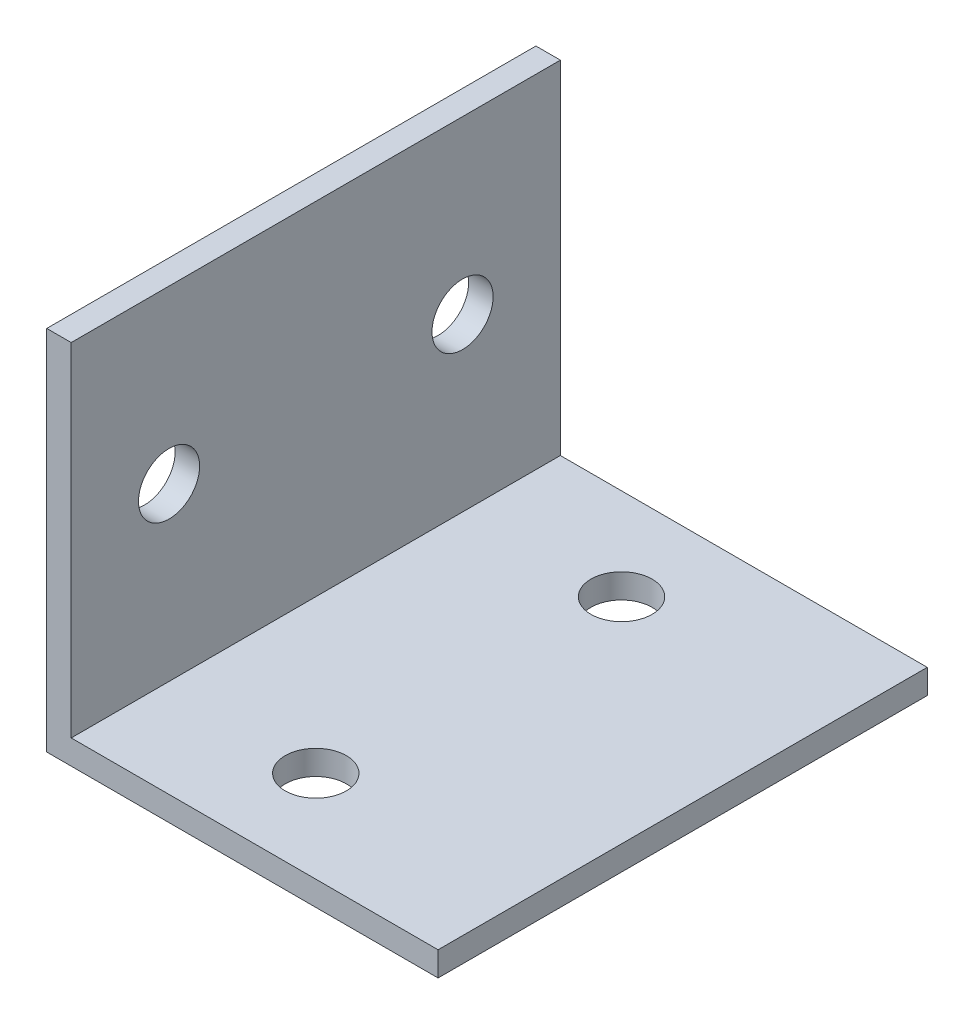
ISO-10303-21;
HEADER;
FILE_DESCRIPTION(('STEP AP214'),'2;1');
FILE_NAME('part.step','',(''),(''),'','','');
FILE_SCHEMA(('AUTOMOTIVE_DESIGN { 1 0 10303 214 1 1 1 1 }'));
ENDSEC;
DATA;
#1=APPLICATION_CONTEXT('core data for automotive mechanical design processes');
#2=APPLICATION_PROTOCOL_DEFINITION('international standard','automotive_design',2000,#1);
#3=PRODUCT_CONTEXT('',#1,'mechanical');
#4=PRODUCT('Part','Part','',(#3));
#5=PRODUCT_RELATED_PRODUCT_CATEGORY('part','',(#4));
#6=PRODUCT_DEFINITION_FORMATION('','',#4);
#7=PRODUCT_DEFINITION_CONTEXT('part definition',#1,'design');
#8=PRODUCT_DEFINITION('design','',#6,#7);
#9=PRODUCT_DEFINITION_SHAPE('','',#8);
#10=(LENGTH_UNIT() NAMED_UNIT(*) SI_UNIT(.MILLI.,.METRE.));
#11=(NAMED_UNIT(*) PLANE_ANGLE_UNIT() SI_UNIT($,.RADIAN.));
#12=(NAMED_UNIT(*) SI_UNIT($,.STERADIAN.) SOLID_ANGLE_UNIT());
#13=UNCERTAINTY_MEASURE_WITH_UNIT(LENGTH_MEASURE(1.E-05),#10,'distance_accuracy_value','');
#14=(GEOMETRIC_REPRESENTATION_CONTEXT(3) GLOBAL_UNCERTAINTY_ASSIGNED_CONTEXT((#13)) GLOBAL_UNIT_ASSIGNED_CONTEXT((#10,
#11,#12)) REPRESENTATION_CONTEXT('',''));
#15=CARTESIAN_POINT('',(0.,0.,0.));
#16=DIRECTION('',(0.,0.,1.));
#17=DIRECTION('',(1.,0.,0.));
#18=AXIS2_PLACEMENT_3D('',#15,#16,#17);
#19=CARTESIAN_POINT('',(0.,0.,40.));
#20=DIRECTION('',(0.,-1.,0.));
#21=DIRECTION('',(0.,0.,-1.));
#22=AXIS2_PLACEMENT_3D('',#19,#20,#21);
#23=PLANE('',#22);
#24=DIRECTION('',(-1.,0.,0.));
#25=VECTOR('',#24,1.);
#26=CARTESIAN_POINT('',(0.,0.,0.));
#27=LINE('',#26,#25);
#28=CARTESIAN_POINT('',(2.,0.,0.));
#29=VERTEX_POINT('',#28);
#30=CARTESIAN_POINT('',(0.,0.,0.));
#31=VERTEX_POINT('',#30);
#32=EDGE_CURVE('E119',#29,#31,#27,.T.);
#33=ORIENTED_EDGE('',*,*,#32,.T.);
#34=DIRECTION('',(0.,0.,-1.));
#35=VECTOR('',#34,1.);
#36=CARTESIAN_POINT('',(0.,0.,40.));
#37=LINE('',#36,#35);
#38=CARTESIAN_POINT('',(0.,0.,40.));
#39=VERTEX_POINT('',#38);
#40=EDGE_CURVE('E11',#39,#31,#37,.T.);
#41=ORIENTED_EDGE('',*,*,#40,.F.);
#42=DIRECTION('',(-1.,0.,0.));
#43=VECTOR('',#42,1.);
#44=CARTESIAN_POINT('',(0.,0.,40.));
#45=LINE('',#44,#43);
#46=CARTESIAN_POINT('',(2.,0.,40.));
#47=VERTEX_POINT('',#46);
#48=EDGE_CURVE('E130',#47,#39,#45,.T.);
#49=ORIENTED_EDGE('',*,*,#48,.F.);
#50=DIRECTION('',(0.,0.,-1.));
#51=VECTOR('',#50,1.);
#52=CARTESIAN_POINT('',(2.,0.,40.));
#53=LINE('',#52,#51);
#54=EDGE_CURVE('E115',#47,#29,#53,.T.);
#55=ORIENTED_EDGE('',*,*,#54,.T.);
#56=EDGE_LOOP('',(#33,#41,#49,#55));
#57=FACE_BOUND('',#56,.T.);
#58=ADVANCED_FACE('F35',(#57),#23,.F.);
#59=CARTESIAN_POINT('',(0.,0.,40.));
#60=DIRECTION('',(1.,0.,0.));
#61=DIRECTION('',(0.,1.,0.));
#62=AXIS2_PLACEMENT_3D('',#59,#60,#61);
#63=PLANE('',#62);
#64=CARTESIAN_POINT('',(0.,-14.,32.));
#65=DIRECTION('',(1.,0.,0.));
#66=DIRECTION('',(0.,1.,0.));
#67=AXIS2_PLACEMENT_3D('',#64,#65,#66);
#68=CIRCLE('',#67,2.49999999999999);
#69=CARTESIAN_POINT('',(0.,-11.5,32.));
#70=VERTEX_POINT('',#69);
#71=EDGE_CURVE('E250',#70,#70,#68,.T.);
#72=ORIENTED_EDGE('',*,*,#71,.T.);
#73=EDGE_LOOP('',(#72));
#74=FACE_BOUND('',#73,.T.);
#75=CARTESIAN_POINT('',(0.,-14.,8.));
#76=DIRECTION('',(1.,0.,0.));
#77=DIRECTION('',(0.,1.,0.));
#78=AXIS2_PLACEMENT_3D('',#75,#76,#77);
#79=CIRCLE('',#78,2.49999999999999);
#80=CARTESIAN_POINT('',(0.,-11.5,8.));
#81=VERTEX_POINT('',#80);
#82=EDGE_CURVE('E259',#81,#81,#79,.T.);
#83=ORIENTED_EDGE('',*,*,#82,.T.);
#84=EDGE_LOOP('',(#83));
#85=FACE_BOUND('',#84,.T.);
#86=DIRECTION('',(0.,-1.,0.));
#87=VECTOR('',#86,1.);
#88=CARTESIAN_POINT('',(0.,0.,0.));
#89=LINE('',#88,#87);
#90=CARTESIAN_POINT('',(0.,-30.,0.));
#91=VERTEX_POINT('',#90);
#92=EDGE_CURVE('E122',#31,#91,#89,.T.);
#93=ORIENTED_EDGE('',*,*,#92,.T.);
#94=DIRECTION('',(0.,0.,-1.));
#95=VECTOR('',#94,1.);
#96=CARTESIAN_POINT('',(0.,-30.,40.));
#97=LINE('',#96,#95);
#98=CARTESIAN_POINT('',(0.,-30.,40.));
#99=VERTEX_POINT('',#98);
#100=EDGE_CURVE('E43',#99,#91,#97,.T.);
#101=ORIENTED_EDGE('',*,*,#100,.F.);
#102=DIRECTION('',(0.,-1.,0.));
#103=VECTOR('',#102,1.);
#104=CARTESIAN_POINT('',(0.,0.,40.));
#105=LINE('',#104,#103);
#106=EDGE_CURVE('E88',#39,#99,#105,.T.);
#107=ORIENTED_EDGE('',*,*,#106,.F.);
#108=ORIENTED_EDGE('',*,*,#40,.T.);
#109=EDGE_LOOP('',(#93,#101,#107,#108));
#110=FACE_BOUND('',#109,.T.);
#111=ADVANCED_FACE('F158',(#74,#85,#110),#63,.F.);
#112=CARTESIAN_POINT('',(0.,-30.,40.));
#113=DIRECTION('',(0.,1.,0.));
#114=DIRECTION('',(0.,0.,1.));
#115=AXIS2_PLACEMENT_3D('',#112,#113,#114);
#116=PLANE('',#115);
#117=CARTESIAN_POINT('',(14.5,-30.,7.5));
#118=DIRECTION('',(0.,1.,0.));
#119=DIRECTION('',(0.,0.,1.));
#120=AXIS2_PLACEMENT_3D('',#117,#118,#119);
#121=CIRCLE('',#120,2.5);
#122=CARTESIAN_POINT('',(14.5,-30.,9.99999999999999));
#123=VERTEX_POINT('',#122);
#124=EDGE_CURVE('E265',#123,#123,#121,.T.);
#125=ORIENTED_EDGE('',*,*,#124,.T.);
#126=EDGE_LOOP('',(#125));
#127=FACE_BOUND('',#126,.T.);
#128=CARTESIAN_POINT('',(14.5,-30.,32.5));
#129=DIRECTION('',(0.,1.,0.));
#130=DIRECTION('',(0.,0.,1.));
#131=AXIS2_PLACEMENT_3D('',#128,#129,#130);
#132=CIRCLE('',#131,2.5);
#133=CARTESIAN_POINT('',(14.5,-30.,35.));
#134=VERTEX_POINT('',#133);
#135=EDGE_CURVE('E123',#134,#134,#132,.T.);
#136=ORIENTED_EDGE('',*,*,#135,.T.);
#137=EDGE_LOOP('',(#136));
#138=FACE_BOUND('',#137,.T.);
#139=DIRECTION('',(1.,0.,0.));
#140=VECTOR('',#139,1.);
#141=CARTESIAN_POINT('',(0.,-30.,0.));
#142=LINE('',#141,#140);
#143=CARTESIAN_POINT('',(32.,-30.,0.));
#144=VERTEX_POINT('',#143);
#145=EDGE_CURVE('E125',#91,#144,#142,.T.);
#146=ORIENTED_EDGE('',*,*,#145,.T.);
#147=DIRECTION('',(0.,0.,-1.));
#148=VECTOR('',#147,1.);
#149=CARTESIAN_POINT('',(32.,-30.,40.));
#150=LINE('',#149,#148);
#151=CARTESIAN_POINT('',(32.,-30.,40.));
#152=VERTEX_POINT('',#151);
#153=EDGE_CURVE('E110',#152,#144,#150,.T.);
#154=ORIENTED_EDGE('',*,*,#153,.F.);
#155=DIRECTION('',(1.,0.,0.));
#156=VECTOR('',#155,1.);
#157=CARTESIAN_POINT('',(0.,-30.,40.));
#158=LINE('',#157,#156);
#159=EDGE_CURVE('E101',#99,#152,#158,.T.);
#160=ORIENTED_EDGE('',*,*,#159,.F.);
#161=ORIENTED_EDGE('',*,*,#100,.T.);
#162=EDGE_LOOP('',(#146,#154,#160,#161));
#163=FACE_BOUND('',#162,.T.);
#164=ADVANCED_FACE('F136',(#127,#138,#163),#116,.F.);
#165=CARTESIAN_POINT('',(32.,-30.,40.));
#166=DIRECTION('',(-1.,0.,0.));
#167=DIRECTION('',(0.,0.,1.));
#168=AXIS2_PLACEMENT_3D('',#165,#166,#167);
#169=PLANE('',#168);
#170=DIRECTION('',(0.,1.,0.));
#171=VECTOR('',#170,1.);
#172=CARTESIAN_POINT('',(32.,-30.,0.));
#173=LINE('',#172,#171);
#174=CARTESIAN_POINT('',(32.,-28.,0.));
#175=VERTEX_POINT('',#174);
#176=EDGE_CURVE('E109',#144,#175,#173,.T.);
#177=ORIENTED_EDGE('',*,*,#176,.T.);
#178=DIRECTION('',(0.,0.,-1.));
#179=VECTOR('',#178,1.);
#180=CARTESIAN_POINT('',(32.,-28.,40.));
#181=LINE('',#180,#179);
#182=CARTESIAN_POINT('',(32.,-28.,40.));
#183=VERTEX_POINT('',#182);
#184=EDGE_CURVE('E106',#183,#175,#181,.T.);
#185=ORIENTED_EDGE('',*,*,#184,.F.);
#186=DIRECTION('',(0.,1.,0.));
#187=VECTOR('',#186,1.);
#188=CARTESIAN_POINT('',(32.,-30.,40.));
#189=LINE('',#188,#187);
#190=EDGE_CURVE('E95',#152,#183,#189,.T.);
#191=ORIENTED_EDGE('',*,*,#190,.F.);
#192=ORIENTED_EDGE('',*,*,#153,.T.);
#193=EDGE_LOOP('',(#177,#185,#191,#192));
#194=FACE_BOUND('',#193,.T.);
#195=ADVANCED_FACE('F107',(#194),#169,.F.);
#196=CARTESIAN_POINT('',(2.,-28.,40.));
#197=DIRECTION('',(0.,-1.,0.));
#198=DIRECTION('',(0.,0.,-1.));
#199=AXIS2_PLACEMENT_3D('',#196,#197,#198);
#200=PLANE('',#199);
#201=CARTESIAN_POINT('',(14.5,-28.,7.5));
#202=DIRECTION('',(0.,1.,0.));
#203=DIRECTION('',(0.,0.,1.));
#204=AXIS2_PLACEMENT_3D('',#201,#202,#203);
#205=CIRCLE('',#204,2.49999999999999);
#206=CARTESIAN_POINT('',(14.5,-28.,9.99999999999999));
#207=VERTEX_POINT('',#206);
#208=EDGE_CURVE('E262',#207,#207,#205,.T.);
#209=ORIENTED_EDGE('',*,*,#208,.F.);
#210=EDGE_LOOP('',(#209));
#211=FACE_BOUND('',#210,.T.);
#212=CARTESIAN_POINT('',(14.5,-28.,32.5));
#213=DIRECTION('',(0.,1.,0.));
#214=DIRECTION('',(0.,0.,1.));
#215=AXIS2_PLACEMENT_3D('',#212,#213,#214);
#216=CIRCLE('',#215,2.49999999999999);
#217=CARTESIAN_POINT('',(14.5,-28.,35.));
#218=VERTEX_POINT('',#217);
#219=EDGE_CURVE('E268',#218,#218,#216,.T.);
#220=ORIENTED_EDGE('',*,*,#219,.F.);
#221=EDGE_LOOP('',(#220));
#222=FACE_BOUND('',#221,.T.);
#223=DIRECTION('',(-1.,0.,0.));
#224=VECTOR('',#223,1.);
#225=CARTESIAN_POINT('',(2.,-28.,0.));
#226=LINE('',#225,#224);
#227=CARTESIAN_POINT('',(2.,-28.,0.));
#228=VERTEX_POINT('',#227);
#229=EDGE_CURVE('E74',#175,#228,#226,.T.);
#230=ORIENTED_EDGE('',*,*,#229,.T.);
#231=DIRECTION('',(0.,0.,-1.));
#232=VECTOR('',#231,1.);
#233=CARTESIAN_POINT('',(2.,-28.,40.));
#234=LINE('',#233,#232);
#235=CARTESIAN_POINT('',(2.,-28.,40.));
#236=VERTEX_POINT('',#235);
#237=EDGE_CURVE('E111',#236,#228,#234,.T.);
#238=ORIENTED_EDGE('',*,*,#237,.F.);
#239=DIRECTION('',(-1.,0.,0.));
#240=VECTOR('',#239,1.);
#241=CARTESIAN_POINT('',(2.,-28.,40.));
#242=LINE('',#241,#240);
#243=EDGE_CURVE('E99',#183,#236,#242,.T.);
#244=ORIENTED_EDGE('',*,*,#243,.F.);
#245=ORIENTED_EDGE('',*,*,#184,.T.);
#246=EDGE_LOOP('',(#230,#238,#244,#245));
#247=FACE_BOUND('',#246,.T.);
#248=ADVANCED_FACE('F113',(#211,#222,#247),#200,.F.);
#249=CARTESIAN_POINT('',(2.,0.,40.));
#250=DIRECTION('',(-1.,0.,0.));
#251=DIRECTION('',(0.,-1.,0.));
#252=AXIS2_PLACEMENT_3D('',#249,#250,#251);
#253=PLANE('',#252);
#254=CARTESIAN_POINT('',(2.,-14.,32.));
#255=DIRECTION('',(1.,0.,0.));
#256=DIRECTION('',(0.,0.,-1.));
#257=AXIS2_PLACEMENT_3D('',#254,#255,#256);
#258=CIRCLE('',#257,2.49999999999999);
#259=CARTESIAN_POINT('',(2.,-14.,29.5));
#260=VERTEX_POINT('',#259);
#261=EDGE_CURVE('E252',#260,#260,#258,.T.);
#262=ORIENTED_EDGE('',*,*,#261,.F.);
#263=EDGE_LOOP('',(#262));
#264=FACE_BOUND('',#263,.T.);
#265=CARTESIAN_POINT('',(2.,-14.,8.));
#266=DIRECTION('',(1.,0.,0.));
#267=DIRECTION('',(0.,0.,-1.));
#268=AXIS2_PLACEMENT_3D('',#265,#266,#267);
#269=CIRCLE('',#268,2.49999999999999);
#270=CARTESIAN_POINT('',(2.,-14.,5.50000000000001));
#271=VERTEX_POINT('',#270);
#272=EDGE_CURVE('E254',#271,#271,#269,.T.);
#273=ORIENTED_EDGE('',*,*,#272,.F.);
#274=EDGE_LOOP('',(#273));
#275=FACE_BOUND('',#274,.T.);
#276=DIRECTION('',(0.,1.,0.));
#277=VECTOR('',#276,1.);
#278=CARTESIAN_POINT('',(2.,0.,0.));
#279=LINE('',#278,#277);
#280=EDGE_CURVE('E80',#228,#29,#279,.T.);
#281=ORIENTED_EDGE('',*,*,#280,.T.);
#282=ORIENTED_EDGE('',*,*,#54,.F.);
#283=DIRECTION('',(0.,1.,0.));
#284=VECTOR('',#283,1.);
#285=CARTESIAN_POINT('',(2.,0.,40.));
#286=LINE('',#285,#284);
#287=EDGE_CURVE('E51',#236,#47,#286,.T.);
#288=ORIENTED_EDGE('',*,*,#287,.F.);
#289=ORIENTED_EDGE('',*,*,#237,.T.);
#290=EDGE_LOOP('',(#281,#282,#288,#289));
#291=FACE_BOUND('',#290,.T.);
#292=ADVANCED_FACE('F143',(#264,#275,#291),#253,.F.);
#293=CARTESIAN_POINT('',(0.,0.,40.));
#294=DIRECTION('',(0.,0.,-1.));
#295=DIRECTION('',(-1.,0.,0.));
#296=AXIS2_PLACEMENT_3D('',#293,#294,#295);
#297=PLANE('',#296);
#298=ORIENTED_EDGE('',*,*,#48,.T.);
#299=ORIENTED_EDGE('',*,*,#106,.T.);
#300=ORIENTED_EDGE('',*,*,#159,.T.);
#301=ORIENTED_EDGE('',*,*,#190,.T.);
#302=ORIENTED_EDGE('',*,*,#243,.T.);
#303=ORIENTED_EDGE('',*,*,#287,.T.);
#304=EDGE_LOOP('',(#298,#299,#300,#301,#302,#303));
#305=FACE_BOUND('',#304,.T.);
#306=ADVANCED_FACE('F97',(#305),#297,.F.);
#307=CARTESIAN_POINT('',(0.,0.,0.));
#308=DIRECTION('',(0.,0.,-1.));
#309=DIRECTION('',(-1.,0.,0.));
#310=AXIS2_PLACEMENT_3D('',#307,#308,#309);
#311=PLANE('',#310);
#312=ORIENTED_EDGE('',*,*,#32,.F.);
#313=ORIENTED_EDGE('',*,*,#280,.F.);
#314=ORIENTED_EDGE('',*,*,#229,.F.);
#315=ORIENTED_EDGE('',*,*,#176,.F.);
#316=ORIENTED_EDGE('',*,*,#145,.F.);
#317=ORIENTED_EDGE('',*,*,#92,.F.);
#318=EDGE_LOOP('',(#312,#313,#314,#315,#316,#317));
#319=FACE_BOUND('',#318,.T.);
#320=ADVANCED_FACE('F139',(#319),#311,.T.);
#321=CARTESIAN_POINT('',(14.5,-28.,32.5));
#322=DIRECTION('',(0.,1.,0.));
#323=DIRECTION('',(0.,0.,1.));
#324=AXIS2_PLACEMENT_3D('',#321,#322,#323);
#325=CYLINDRICAL_SURFACE('',#324,2.5);
#326=ORIENTED_EDGE('',*,*,#135,.F.);
#327=EDGE_LOOP('',(#326));
#328=FACE_BOUND('',#327,.T.);
#329=ORIENTED_EDGE('',*,*,#219,.T.);
#330=EDGE_LOOP('',(#329));
#331=FACE_BOUND('',#330,.T.);
#332=ADVANCED_FACE('F190',(#328,#331),#325,.F.);
#333=CARTESIAN_POINT('',(14.5,-28.,7.5));
#334=DIRECTION('',(0.,1.,0.));
#335=DIRECTION('',(0.,0.,1.));
#336=AXIS2_PLACEMENT_3D('',#333,#334,#335);
#337=CYLINDRICAL_SURFACE('',#336,2.5);
#338=ORIENTED_EDGE('',*,*,#124,.F.);
#339=EDGE_LOOP('',(#338));
#340=FACE_BOUND('',#339,.T.);
#341=ORIENTED_EDGE('',*,*,#208,.T.);
#342=EDGE_LOOP('',(#341));
#343=FACE_BOUND('',#342,.T.);
#344=ADVANCED_FACE('F195',(#340,#343),#337,.F.);
#345=CARTESIAN_POINT('',(2.,-14.,8.));
#346=DIRECTION('',(1.,0.,0.));
#347=DIRECTION('',(0.,0.,-1.));
#348=AXIS2_PLACEMENT_3D('',#345,#346,#347);
#349=CYLINDRICAL_SURFACE('',#348,2.49999999999999);
#350=ORIENTED_EDGE('',*,*,#82,.F.);
#351=EDGE_LOOP('',(#350));
#352=FACE_BOUND('',#351,.T.);
#353=ORIENTED_EDGE('',*,*,#272,.T.);
#354=EDGE_LOOP('',(#353));
#355=FACE_BOUND('',#354,.T.);
#356=ADVANCED_FACE('F206',(#352,#355),#349,.F.);
#357=CARTESIAN_POINT('',(2.,-14.,32.));
#358=DIRECTION('',(1.,0.,0.));
#359=DIRECTION('',(0.,0.,-1.));
#360=AXIS2_PLACEMENT_3D('',#357,#358,#359);
#361=CYLINDRICAL_SURFACE('',#360,2.49999999999999);
#362=ORIENTED_EDGE('',*,*,#71,.F.);
#363=EDGE_LOOP('',(#362));
#364=FACE_BOUND('',#363,.T.);
#365=ORIENTED_EDGE('',*,*,#261,.T.);
#366=EDGE_LOOP('',(#365));
#367=FACE_BOUND('',#366,.T.);
#368=ADVANCED_FACE('F226',(#364,#367),#361,.F.);
#369=CLOSED_SHELL('',(#58,#111,#164,#195,#248,#292,#306,#320,#332,#344,#356,#368));
#370=MANIFOLD_SOLID_BREP('B2',#369);
#371=ADVANCED_BREP_SHAPE_REPRESENTATION('',(#18,#370),#14);
#372=SHAPE_DEFINITION_REPRESENTATION(#9,#371);
ENDSEC;
END-ISO-10303-21;
